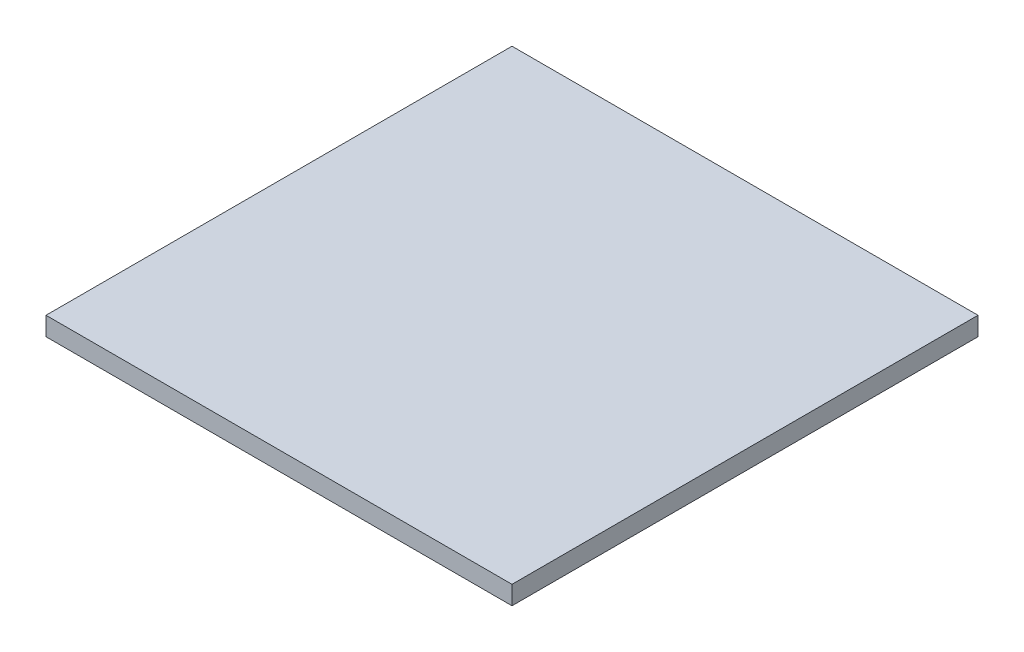
ISO-10303-21;
HEADER;
FILE_DESCRIPTION(('STEP AP214'),'2;1');
FILE_NAME('part.step','',(''),(''),'','','');
FILE_SCHEMA(('AUTOMOTIVE_DESIGN { 1 0 10303 214 1 1 1 1 }'));
ENDSEC;
DATA;
#1=APPLICATION_CONTEXT('core data for automotive mechanical design processes');
#2=APPLICATION_PROTOCOL_DEFINITION('international standard','automotive_design',2000,#1);
#3=PRODUCT_CONTEXT('',#1,'mechanical');
#4=PRODUCT('Part','Part','',(#3));
#5=PRODUCT_RELATED_PRODUCT_CATEGORY('part','',(#4));
#6=PRODUCT_DEFINITION_FORMATION('','',#4);
#7=PRODUCT_DEFINITION_CONTEXT('part definition',#1,'design');
#8=PRODUCT_DEFINITION('design','',#6,#7);
#9=PRODUCT_DEFINITION_SHAPE('','',#8);
#10=(LENGTH_UNIT() NAMED_UNIT(*) SI_UNIT(.MILLI.,.METRE.));
#11=(NAMED_UNIT(*) PLANE_ANGLE_UNIT() SI_UNIT($,.RADIAN.));
#12=(NAMED_UNIT(*) SI_UNIT($,.STERADIAN.) SOLID_ANGLE_UNIT());
#13=UNCERTAINTY_MEASURE_WITH_UNIT(LENGTH_MEASURE(1.E-05),#10,'distance_accuracy_value','');
#14=(GEOMETRIC_REPRESENTATION_CONTEXT(3) GLOBAL_UNCERTAINTY_ASSIGNED_CONTEXT((#13)) GLOBAL_UNIT_ASSIGNED_CONTEXT((#10,
#11,#12)) REPRESENTATION_CONTEXT('',''));
#15=CARTESIAN_POINT('',(0.,0.,0.));
#16=DIRECTION('',(0.,0.,1.));
#17=DIRECTION('',(1.,0.,0.));
#18=AXIS2_PLACEMENT_3D('',#15,#16,#17);
#19=CARTESIAN_POINT('',(0.,18.25625,0.));
#20=DIRECTION('',(1.,0.,0.));
#21=DIRECTION('',(0.,0.,-1.));
#22=AXIS2_PLACEMENT_3D('',#19,#20,#21);
#23=PLANE('',#22);
#24=DIRECTION('',(0.,0.,1.));
#25=VECTOR('',#24,1.);
#26=CARTESIAN_POINT('',(0.,0.,0.));
#27=LINE('',#26,#25);
#28=CARTESIAN_POINT('',(0.,0.,-457.2));
#29=VERTEX_POINT('',#28);
#30=CARTESIAN_POINT('',(0.,0.,0.));
#31=VERTEX_POINT('',#30);
#32=EDGE_CURVE('E95',#29,#31,#27,.T.);
#33=ORIENTED_EDGE('',*,*,#32,.T.);
#34=DIRECTION('',(0.,-1.,0.));
#35=VECTOR('',#34,1.);
#36=CARTESIAN_POINT('',(0.,18.25625,0.));
#37=LINE('',#36,#35);
#38=CARTESIAN_POINT('',(0.,18.25625,0.));
#39=VERTEX_POINT('',#38);
#40=EDGE_CURVE('E11',#39,#31,#37,.T.);
#41=ORIENTED_EDGE('',*,*,#40,.F.);
#42=DIRECTION('',(0.,0.,1.));
#43=VECTOR('',#42,1.);
#44=CARTESIAN_POINT('',(0.,18.25625,0.));
#45=LINE('',#44,#43);
#46=CARTESIAN_POINT('',(0.,18.25625,-457.2));
#47=VERTEX_POINT('',#46);
#48=EDGE_CURVE('E83',#47,#39,#45,.T.);
#49=ORIENTED_EDGE('',*,*,#48,.F.);
#50=DIRECTION('',(0.,-1.,0.));
#51=VECTOR('',#50,1.);
#52=CARTESIAN_POINT('',(0.,18.25625,-457.2));
#53=LINE('',#52,#51);
#54=EDGE_CURVE('E91',#47,#29,#53,.T.);
#55=ORIENTED_EDGE('',*,*,#54,.T.);
#56=EDGE_LOOP('',(#33,#41,#49,#55));
#57=FACE_BOUND('',#56,.T.);
#58=ADVANCED_FACE('F32',(#57),#23,.F.);
#59=CARTESIAN_POINT('',(0.,18.25625,0.));
#60=DIRECTION('',(0.,0.,-1.));
#61=DIRECTION('',(-1.,0.,0.));
#62=AXIS2_PLACEMENT_3D('',#59,#60,#61);
#63=PLANE('',#62);
#64=DIRECTION('',(1.,0.,0.));
#65=VECTOR('',#64,1.);
#66=CARTESIAN_POINT('',(0.,0.,0.));
#67=LINE('',#66,#65);
#68=CARTESIAN_POINT('',(457.2,0.,0.));
#69=VERTEX_POINT('',#68);
#70=EDGE_CURVE('E87',#31,#69,#67,.T.);
#71=ORIENTED_EDGE('',*,*,#70,.T.);
#72=DIRECTION('',(0.,-1.,0.));
#73=VECTOR('',#72,1.);
#74=CARTESIAN_POINT('',(457.2,18.25625,0.));
#75=LINE('',#74,#73);
#76=CARTESIAN_POINT('',(457.2,18.25625,0.));
#77=VERTEX_POINT('',#76);
#78=EDGE_CURVE('E40',#77,#69,#75,.T.);
#79=ORIENTED_EDGE('',*,*,#78,.F.);
#80=DIRECTION('',(1.,0.,0.));
#81=VECTOR('',#80,1.);
#82=CARTESIAN_POINT('',(0.,18.25625,0.));
#83=LINE('',#82,#81);
#84=EDGE_CURVE('E78',#39,#77,#83,.T.);
#85=ORIENTED_EDGE('',*,*,#84,.F.);
#86=ORIENTED_EDGE('',*,*,#40,.T.);
#87=EDGE_LOOP('',(#71,#79,#85,#86));
#88=FACE_BOUND('',#87,.T.);
#89=ADVANCED_FACE('F86',(#88),#63,.F.);
#90=CARTESIAN_POINT('',(457.2,18.25625,0.));
#91=DIRECTION('',(-1.,0.,0.));
#92=DIRECTION('',(0.,0.,1.));
#93=AXIS2_PLACEMENT_3D('',#90,#91,#92);
#94=PLANE('',#93);
#95=DIRECTION('',(0.,0.,-1.));
#96=VECTOR('',#95,1.);
#97=CARTESIAN_POINT('',(457.2,0.,0.));
#98=LINE('',#97,#96);
#99=CARTESIAN_POINT('',(457.2,0.,-457.2));
#100=VERTEX_POINT('',#99);
#101=EDGE_CURVE('E65',#69,#100,#98,.T.);
#102=ORIENTED_EDGE('',*,*,#101,.T.);
#103=DIRECTION('',(0.,-1.,0.));
#104=VECTOR('',#103,1.);
#105=CARTESIAN_POINT('',(457.2,18.25625,-457.2));
#106=LINE('',#105,#104);
#107=CARTESIAN_POINT('',(457.2,18.25625,-457.2));
#108=VERTEX_POINT('',#107);
#109=EDGE_CURVE('E88',#108,#100,#106,.T.);
#110=ORIENTED_EDGE('',*,*,#109,.F.);
#111=DIRECTION('',(0.,0.,-1.));
#112=VECTOR('',#111,1.);
#113=CARTESIAN_POINT('',(457.2,18.25625,0.));
#114=LINE('',#113,#112);
#115=EDGE_CURVE('E81',#77,#108,#114,.T.);
#116=ORIENTED_EDGE('',*,*,#115,.F.);
#117=ORIENTED_EDGE('',*,*,#78,.T.);
#118=EDGE_LOOP('',(#102,#110,#116,#117));
#119=FACE_BOUND('',#118,.T.);
#120=ADVANCED_FACE('F89',(#119),#94,.F.);
#121=CARTESIAN_POINT('',(0.,18.25625,-457.2));
#122=DIRECTION('',(0.,0.,1.));
#123=DIRECTION('',(1.,0.,0.));
#124=AXIS2_PLACEMENT_3D('',#121,#122,#123);
#125=PLANE('',#124);
#126=DIRECTION('',(-1.,0.,0.));
#127=VECTOR('',#126,1.);
#128=CARTESIAN_POINT('',(0.,0.,-457.2));
#129=LINE('',#128,#127);
#130=EDGE_CURVE('E71',#100,#29,#129,.T.);
#131=ORIENTED_EDGE('',*,*,#130,.T.);
#132=ORIENTED_EDGE('',*,*,#54,.F.);
#133=DIRECTION('',(-1.,0.,0.));
#134=VECTOR('',#133,1.);
#135=CARTESIAN_POINT('',(0.,18.25625,-457.2));
#136=LINE('',#135,#134);
#137=EDGE_CURVE('E48',#108,#47,#136,.T.);
#138=ORIENTED_EDGE('',*,*,#137,.F.);
#139=ORIENTED_EDGE('',*,*,#109,.T.);
#140=EDGE_LOOP('',(#131,#132,#138,#139));
#141=FACE_BOUND('',#140,.T.);
#142=ADVANCED_FACE('F102',(#141),#125,.F.);
#143=CARTESIAN_POINT('',(0.,18.25625,0.));
#144=DIRECTION('',(0.,-1.,0.));
#145=DIRECTION('',(0.,0.,-1.));
#146=AXIS2_PLACEMENT_3D('',#143,#144,#145);
#147=PLANE('',#146);
#148=ORIENTED_EDGE('',*,*,#48,.T.);
#149=ORIENTED_EDGE('',*,*,#84,.T.);
#150=ORIENTED_EDGE('',*,*,#115,.T.);
#151=ORIENTED_EDGE('',*,*,#137,.T.);
#152=EDGE_LOOP('',(#148,#149,#150,#151));
#153=FACE_BOUND('',#152,.T.);
#154=ADVANCED_FACE('F79',(#153),#147,.F.);
#155=CARTESIAN_POINT('',(0.,0.,0.));
#156=DIRECTION('',(0.,-1.,0.));
#157=DIRECTION('',(0.,0.,-1.));
#158=AXIS2_PLACEMENT_3D('',#155,#156,#157);
#159=PLANE('',#158);
#160=ORIENTED_EDGE('',*,*,#32,.F.);
#161=ORIENTED_EDGE('',*,*,#130,.F.);
#162=ORIENTED_EDGE('',*,*,#101,.F.);
#163=ORIENTED_EDGE('',*,*,#70,.F.);
#164=EDGE_LOOP('',(#160,#161,#162,#163));
#165=FACE_BOUND('',#164,.T.);
#166=ADVANCED_FACE('F105',(#165),#159,.T.);
#167=CLOSED_SHELL('',(#58,#89,#120,#142,#154,#166));
#168=MANIFOLD_SOLID_BREP('B2',#167);
#169=ADVANCED_BREP_SHAPE_REPRESENTATION('',(#18,#168),#14);
#170=SHAPE_DEFINITION_REPRESENTATION(#9,#169);
ENDSEC;
END-ISO-10303-21;
